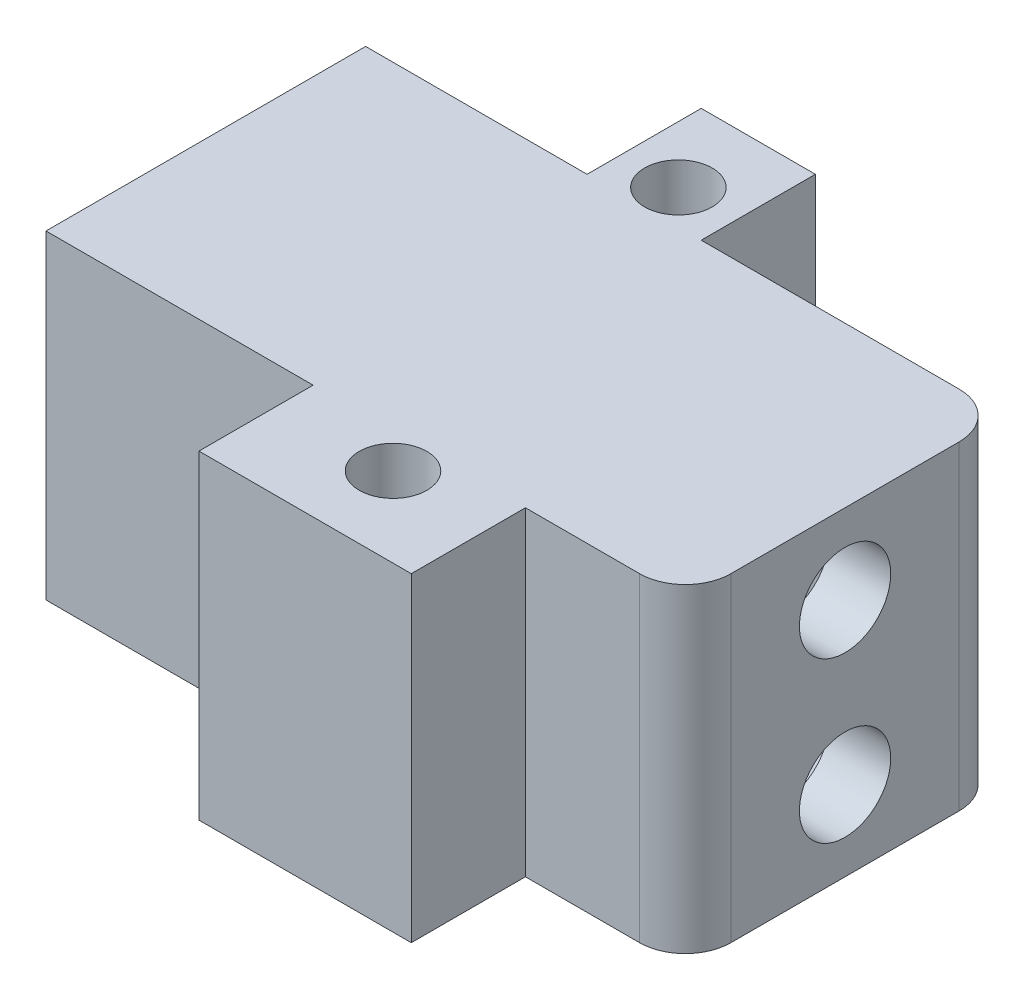
ISO-10303-21;
HEADER;
FILE_DESCRIPTION(('STEP AP214'),'2;1');
FILE_NAME('part.step','',(''),(''),'','','');
FILE_SCHEMA(('AUTOMOTIVE_DESIGN { 1 0 10303 214 1 1 1 1 }'));
ENDSEC;
DATA;
#1=APPLICATION_CONTEXT('core data for automotive mechanical design processes');
#2=APPLICATION_PROTOCOL_DEFINITION('international standard','automotive_design',2000,#1);
#3=PRODUCT_CONTEXT('',#1,'mechanical');
#4=PRODUCT('Part','Part','',(#3));
#5=PRODUCT_RELATED_PRODUCT_CATEGORY('part','',(#4));
#6=PRODUCT_DEFINITION_FORMATION('','',#4);
#7=PRODUCT_DEFINITION_CONTEXT('part definition',#1,'design');
#8=PRODUCT_DEFINITION('design','',#6,#7);
#9=PRODUCT_DEFINITION_SHAPE('','',#8);
#10=(LENGTH_UNIT() NAMED_UNIT(*) SI_UNIT(.MILLI.,.METRE.));
#11=(NAMED_UNIT(*) PLANE_ANGLE_UNIT() SI_UNIT($,.RADIAN.));
#12=(NAMED_UNIT(*) SI_UNIT($,.STERADIAN.) SOLID_ANGLE_UNIT());
#13=UNCERTAINTY_MEASURE_WITH_UNIT(LENGTH_MEASURE(1.E-05),#10,'distance_accuracy_value','');
#14=(GEOMETRIC_REPRESENTATION_CONTEXT(3) GLOBAL_UNCERTAINTY_ASSIGNED_CONTEXT((#13)) GLOBAL_UNIT_ASSIGNED_CONTEXT((#10,
#11,#12)) REPRESENTATION_CONTEXT('',''));
#15=CARTESIAN_POINT('',(0.,0.,0.));
#16=DIRECTION('',(0.,0.,1.));
#17=DIRECTION('',(1.,0.,0.));
#18=AXIS2_PLACEMENT_3D('',#15,#16,#17);
#19=CARTESIAN_POINT('',(-14.,14.,-7.));
#20=DIRECTION('',(0.,0.,1.));
#21=DIRECTION('',(1.,0.,0.));
#22=AXIS2_PLACEMENT_3D('',#19,#20,#21);
#23=PLANE('',#22);
#24=DIRECTION('',(0.,-1.,0.));
#25=VECTOR('',#24,1.);
#26=CARTESIAN_POINT('',(0.700000000000311,0.,-7.));
#27=LINE('',#26,#25);
#28=CARTESIAN_POINT('',(0.700000000000311,14.,-7.));
#29=VERTEX_POINT('',#28);
#30=CARTESIAN_POINT('',(0.700000000000311,0.,-7.));
#31=VERTEX_POINT('',#30);
#32=EDGE_CURVE('E70',#29,#31,#27,.T.);
#33=ORIENTED_EDGE('',*,*,#32,.F.);
#34=DIRECTION('',(-1.,0.,0.));
#35=VECTOR('',#34,1.);
#36=CARTESIAN_POINT('',(-14.,14.,-7.));
#37=LINE('',#36,#35);
#38=CARTESIAN_POINT('',(12.,14.,-7.));
#39=VERTEX_POINT('',#38);
#40=EDGE_CURVE('E281',#39,#29,#37,.T.);
#41=ORIENTED_EDGE('',*,*,#40,.F.);
#42=DIRECTION('',(0.,-1.,0.));
#43=VECTOR('',#42,1.);
#44=CARTESIAN_POINT('',(12.,14.,-7.));
#45=LINE('',#44,#43);
#46=CARTESIAN_POINT('',(12.,0.,-7.));
#47=VERTEX_POINT('',#46);
#48=EDGE_CURVE('E304',#39,#47,#45,.T.);
#49=ORIENTED_EDGE('',*,*,#48,.T.);
#50=DIRECTION('',(-1.,0.,0.));
#51=VECTOR('',#50,1.);
#52=CARTESIAN_POINT('',(-14.,0.,-7.));
#53=LINE('',#52,#51);
#54=EDGE_CURVE('E293',#47,#31,#53,.T.);
#55=ORIENTED_EDGE('',*,*,#54,.T.);
#56=EDGE_LOOP('',(#33,#41,#49,#55));
#57=FACE_BOUND('',#56,.T.);
#58=ADVANCED_FACE('F45',(#57),#23,.F.);
#59=CARTESIAN_POINT('',(-14.,14.,7.));
#60=DIRECTION('',(0.,0.,-1.));
#61=DIRECTION('',(-1.,0.,0.));
#62=AXIS2_PLACEMENT_3D('',#59,#60,#61);
#63=PLANE('',#62);
#64=DIRECTION('',(0.,-1.,0.));
#65=VECTOR('',#64,1.);
#66=CARTESIAN_POINT('',(-2.3,0.,7.));
#67=LINE('',#66,#65);
#68=CARTESIAN_POINT('',(-2.3,14.,7.));
#69=VERTEX_POINT('',#68);
#70=CARTESIAN_POINT('',(-2.3,0.,7.));
#71=VERTEX_POINT('',#70);
#72=EDGE_CURVE('E182',#69,#71,#67,.T.);
#73=ORIENTED_EDGE('',*,*,#72,.F.);
#74=DIRECTION('',(1.,0.,0.));
#75=VECTOR('',#74,1.);
#76=CARTESIAN_POINT('',(-14.,14.,7.));
#77=LINE('',#76,#75);
#78=CARTESIAN_POINT('',(-14.,14.,7.));
#79=VERTEX_POINT('',#78);
#80=EDGE_CURVE('E286',#79,#69,#77,.T.);
#81=ORIENTED_EDGE('',*,*,#80,.F.);
#82=DIRECTION('',(0.,-1.,0.));
#83=VECTOR('',#82,1.);
#84=CARTESIAN_POINT('',(-14.,14.,7.));
#85=LINE('',#84,#83);
#86=CARTESIAN_POINT('',(-14.,0.,7.));
#87=VERTEX_POINT('',#86);
#88=EDGE_CURVE('E289',#79,#87,#85,.T.);
#89=ORIENTED_EDGE('',*,*,#88,.T.);
#90=DIRECTION('',(1.,0.,0.));
#91=VECTOR('',#90,1.);
#92=CARTESIAN_POINT('',(-14.,0.,7.));
#93=LINE('',#92,#91);
#94=EDGE_CURVE('E280',#87,#71,#93,.T.);
#95=ORIENTED_EDGE('',*,*,#94,.T.);
#96=EDGE_LOOP('',(#73,#81,#89,#95));
#97=FACE_BOUND('',#96,.T.);
#98=ADVANCED_FACE('F356',(#97),#63,.F.);
#99=DIRECTION('',(0.,1.,0.));
#100=VECTOR('',#99,1.);
#101=CARTESIAN_POINT('',(7.,0.,7.));
#102=LINE('',#101,#100);
#103=CARTESIAN_POINT('',(7.,0.,7.));
#104=VERTEX_POINT('',#103);
#105=CARTESIAN_POINT('',(7.,14.,7.));
#106=VERTEX_POINT('',#105);
#107=EDGE_CURVE('E217',#104,#106,#102,.T.);
#108=ORIENTED_EDGE('',*,*,#107,.F.);
#109=CARTESIAN_POINT('',(12.,0.,7.));
#110=VERTEX_POINT('',#109);
#111=EDGE_CURVE('E297',#104,#110,#93,.T.);
#112=ORIENTED_EDGE('',*,*,#111,.T.);
#113=DIRECTION('',(0.,-1.,0.));
#114=VECTOR('',#113,1.);
#115=CARTESIAN_POINT('',(12.,14.,7.));
#116=LINE('',#115,#114);
#117=CARTESIAN_POINT('',(12.,14.,7.));
#118=VERTEX_POINT('',#117);
#119=EDGE_CURVE('E11',#110,#118,#116,.F.);
#120=ORIENTED_EDGE('',*,*,#119,.T.);
#121=EDGE_CURVE('E285',#106,#118,#77,.T.);
#122=ORIENTED_EDGE('',*,*,#121,.F.);
#123=EDGE_LOOP('',(#108,#112,#120,#122));
#124=FACE_BOUND('',#123,.T.);
#125=ADVANCED_FACE('F363',(#124),#63,.F.);
#126=CARTESIAN_POINT('',(14.,14.,-7.));
#127=DIRECTION('',(-1.,0.,0.));
#128=DIRECTION('',(0.,0.,1.));
#129=AXIS2_PLACEMENT_3D('',#126,#127,#128);
#130=PLANE('',#129);
#131=CARTESIAN_POINT('',(14.,10.5,0.));
#132=DIRECTION('',(1.,0.,0.));
#133=DIRECTION('',(0.,0.,-1.));
#134=AXIS2_PLACEMENT_3D('',#131,#132,#133);
#135=CIRCLE('',#134,2.);
#136=CARTESIAN_POINT('',(14.,10.5,-2.));
#137=VERTEX_POINT('',#136);
#138=EDGE_CURVE('E240',#137,#137,#135,.T.);
#139=ORIENTED_EDGE('',*,*,#138,.F.);
#140=EDGE_LOOP('',(#139));
#141=FACE_BOUND('',#140,.T.);
#142=CARTESIAN_POINT('',(14.,3.5,0.));
#143=DIRECTION('',(1.,0.,0.));
#144=DIRECTION('',(0.,0.,-1.));
#145=AXIS2_PLACEMENT_3D('',#142,#143,#144);
#146=CIRCLE('',#145,2.);
#147=CARTESIAN_POINT('',(14.,3.5,-2.));
#148=VERTEX_POINT('',#147);
#149=EDGE_CURVE('E239',#148,#148,#146,.T.);
#150=ORIENTED_EDGE('',*,*,#149,.F.);
#151=EDGE_LOOP('',(#150));
#152=FACE_BOUND('',#151,.T.);
#153=DIRECTION('',(0.,0.,-1.));
#154=VECTOR('',#153,1.);
#155=CARTESIAN_POINT('',(14.,0.,-7.));
#156=LINE('',#155,#154);
#157=CARTESIAN_POINT('',(14.,0.,5.));
#158=VERTEX_POINT('',#157);
#159=CARTESIAN_POINT('',(14.,0.,-5.));
#160=VERTEX_POINT('',#159);
#161=EDGE_CURVE('E271',#158,#160,#156,.T.);
#162=ORIENTED_EDGE('',*,*,#161,.T.);
#163=DIRECTION('',(0.,-1.,0.));
#164=VECTOR('',#163,1.);
#165=CARTESIAN_POINT('',(14.,14.,-5.));
#166=LINE('',#165,#164);
#167=CARTESIAN_POINT('',(14.,14.,-5.));
#168=VERTEX_POINT('',#167);
#169=EDGE_CURVE('E319',#160,#168,#166,.F.);
#170=ORIENTED_EDGE('',*,*,#169,.T.);
#171=DIRECTION('',(0.,0.,-1.));
#172=VECTOR('',#171,1.);
#173=CARTESIAN_POINT('',(14.,14.,-7.));
#174=LINE('',#173,#172);
#175=CARTESIAN_POINT('',(14.,14.,5.));
#176=VERTEX_POINT('',#175);
#177=EDGE_CURVE('E278',#176,#168,#174,.T.);
#178=ORIENTED_EDGE('',*,*,#177,.F.);
#179=DIRECTION('',(0.,-1.,0.));
#180=VECTOR('',#179,1.);
#181=CARTESIAN_POINT('',(14.,14.,5.));
#182=LINE('',#181,#180);
#183=EDGE_CURVE('E316',#176,#158,#182,.T.);
#184=ORIENTED_EDGE('',*,*,#183,.T.);
#185=EDGE_LOOP('',(#162,#170,#178,#184));
#186=FACE_BOUND('',#185,.T.);
#187=ADVANCED_FACE('F367',(#141,#152,#186),#130,.F.);
#188=CARTESIAN_POINT('',(-4.29999999999969,14.,-7.));
#189=VERTEX_POINT('',#188);
#190=CARTESIAN_POINT('',(-14.,14.,-7.));
#191=VERTEX_POINT('',#190);
#192=EDGE_CURVE('E62',#189,#191,#37,.T.);
#193=ORIENTED_EDGE('',*,*,#192,.F.);
#194=DIRECTION('',(0.,-1.,0.));
#195=VECTOR('',#194,1.);
#196=CARTESIAN_POINT('',(-4.29999999999969,0.,-7.));
#197=LINE('',#196,#195);
#198=CARTESIAN_POINT('',(-4.29999999999969,0.,-7.));
#199=VERTEX_POINT('',#198);
#200=EDGE_CURVE('E180',#189,#199,#197,.T.);
#201=ORIENTED_EDGE('',*,*,#200,.T.);
#202=CARTESIAN_POINT('',(-14.,0.,-7.));
#203=VERTEX_POINT('',#202);
#204=EDGE_CURVE('E292',#199,#203,#53,.T.);
#205=ORIENTED_EDGE('',*,*,#204,.T.);
#206=DIRECTION('',(0.,-1.,0.));
#207=VECTOR('',#206,1.);
#208=CARTESIAN_POINT('',(-14.,14.,-7.));
#209=LINE('',#208,#207);
#210=EDGE_CURVE('E301',#191,#203,#209,.T.);
#211=ORIENTED_EDGE('',*,*,#210,.F.);
#212=EDGE_LOOP('',(#193,#201,#205,#211));
#213=FACE_BOUND('',#212,.T.);
#214=ADVANCED_FACE('F351',(#213),#23,.F.);
#215=CARTESIAN_POINT('',(-14.,14.,-7.));
#216=DIRECTION('',(1.,0.,0.));
#217=DIRECTION('',(0.,0.,-1.));
#218=AXIS2_PLACEMENT_3D('',#215,#216,#217);
#219=PLANE('',#218);
#220=DIRECTION('',(0.,-1.,0.));
#221=VECTOR('',#220,1.);
#222=CARTESIAN_POINT('',(-14.,13.,5.));
#223=LINE('',#222,#221);
#224=CARTESIAN_POINT('',(-14.,13.,5.));
#225=VERTEX_POINT('',#224);
#226=CARTESIAN_POINT('',(-14.,0.999999999999999,5.));
#227=VERTEX_POINT('',#226);
#228=EDGE_CURVE('E260',#225,#227,#223,.T.);
#229=ORIENTED_EDGE('',*,*,#228,.T.);
#230=DIRECTION('',(0.,0.,1.));
#231=VECTOR('',#230,1.);
#232=CARTESIAN_POINT('',(-14.,1.,-5.));
#233=LINE('',#232,#231);
#234=CARTESIAN_POINT('',(-14.,1.,-5.));
#235=VERTEX_POINT('',#234);
#236=EDGE_CURVE('E258',#235,#227,#233,.T.);
#237=ORIENTED_EDGE('',*,*,#236,.F.);
#238=DIRECTION('',(0.,-1.,0.));
#239=VECTOR('',#238,1.);
#240=CARTESIAN_POINT('',(-14.,13.,-5.));
#241=LINE('',#240,#239);
#242=CARTESIAN_POINT('',(-14.,13.,-5.));
#243=VERTEX_POINT('',#242);
#244=EDGE_CURVE('E250',#243,#235,#241,.T.);
#245=ORIENTED_EDGE('',*,*,#244,.F.);
#246=DIRECTION('',(0.,0.,1.));
#247=VECTOR('',#246,1.);
#248=CARTESIAN_POINT('',(-14.,13.,-5.));
#249=LINE('',#248,#247);
#250=EDGE_CURVE('E264',#243,#225,#249,.T.);
#251=ORIENTED_EDGE('',*,*,#250,.T.);
#252=EDGE_LOOP('',(#229,#237,#245,#251));
#253=FACE_BOUND('',#252,.T.);
#254=DIRECTION('',(0.,0.,1.));
#255=VECTOR('',#254,1.);
#256=CARTESIAN_POINT('',(-14.,0.,-7.));
#257=LINE('',#256,#255);
#258=EDGE_CURVE('E295',#203,#87,#257,.T.);
#259=ORIENTED_EDGE('',*,*,#258,.T.);
#260=ORIENTED_EDGE('',*,*,#88,.F.);
#261=DIRECTION('',(0.,0.,1.));
#262=VECTOR('',#261,1.);
#263=CARTESIAN_POINT('',(-14.,14.,-7.));
#264=LINE('',#263,#262);
#265=EDGE_CURVE('E283',#191,#79,#264,.T.);
#266=ORIENTED_EDGE('',*,*,#265,.F.);
#267=ORIENTED_EDGE('',*,*,#210,.T.);
#268=EDGE_LOOP('',(#259,#260,#266,#267));
#269=FACE_BOUND('',#268,.T.);
#270=ADVANCED_FACE('F340',(#253,#269),#219,.F.);
#271=CARTESIAN_POINT('',(0.,14.,0.));
#272=DIRECTION('',(0.,1.,0.));
#273=DIRECTION('',(0.,0.,1.));
#274=AXIS2_PLACEMENT_3D('',#271,#272,#273);
#275=PLANE('',#274);
#276=CARTESIAN_POINT('',(2.69999999999893,14.,8.49999999999966));
#277=DIRECTION('',(0.,1.,0.));
#278=DIRECTION('',(0.,0.,1.));
#279=AXIS2_PLACEMENT_3D('',#276,#277,#278);
#280=CIRCLE('',#279,1.47999999999999);
#281=CARTESIAN_POINT('',(2.69999999999893,14.,9.97999999999965));
#282=VERTEX_POINT('',#281);
#283=EDGE_CURVE('E325',#282,#282,#280,.T.);
#284=ORIENTED_EDGE('',*,*,#283,.F.);
#285=EDGE_LOOP('',(#284));
#286=FACE_BOUND('',#285,.T.);
#287=CARTESIAN_POINT('',(-1.80000000000077,14.,-8.50000000000041));
#288=DIRECTION('',(0.,1.,0.));
#289=DIRECTION('',(0.,0.,1.));
#290=AXIS2_PLACEMENT_3D('',#287,#288,#289);
#291=CIRCLE('',#290,1.47999999999999);
#292=CARTESIAN_POINT('',(-1.80000000000077,14.,-7.02000000000042));
#293=VERTEX_POINT('',#292);
#294=EDGE_CURVE('E201',#293,#293,#291,.T.);
#295=ORIENTED_EDGE('',*,*,#294,.F.);
#296=EDGE_LOOP('',(#295));
#297=FACE_BOUND('',#296,.T.);
#298=ORIENTED_EDGE('',*,*,#177,.T.);
#299=CARTESIAN_POINT('',(12.,14.,-5.));
#300=DIRECTION('',(0.,1.,0.));
#301=DIRECTION('',(0.,0.,1.));
#302=AXIS2_PLACEMENT_3D('',#299,#300,#301);
#303=CIRCLE('',#302,2.);
#304=EDGE_CURVE('E54',#168,#39,#303,.T.);
#305=ORIENTED_EDGE('',*,*,#304,.T.);
#306=ORIENTED_EDGE('',*,*,#40,.T.);
#307=DIRECTION('',(0.,0.,1.));
#308=VECTOR('',#307,1.);
#309=CARTESIAN_POINT('',(0.700000000000311,14.,-12.));
#310=LINE('',#309,#308);
#311=CARTESIAN_POINT('',(0.700000000000311,14.,-12.));
#312=VERTEX_POINT('',#311);
#313=EDGE_CURVE('E183',#312,#29,#310,.T.);
#314=ORIENTED_EDGE('',*,*,#313,.F.);
#315=DIRECTION('',(1.,0.,0.));
#316=VECTOR('',#315,1.);
#317=CARTESIAN_POINT('',(0.,14.,-12.));
#318=LINE('',#317,#316);
#319=CARTESIAN_POINT('',(-4.29999999999969,14.,-12.));
#320=VERTEX_POINT('',#319);
#321=EDGE_CURVE('E186',#320,#312,#318,.T.);
#322=ORIENTED_EDGE('',*,*,#321,.F.);
#323=DIRECTION('',(0.,0.,1.));
#324=VECTOR('',#323,1.);
#325=CARTESIAN_POINT('',(-4.29999999999969,14.,-12.));
#326=LINE('',#325,#324);
#327=EDGE_CURVE('E174',#320,#189,#326,.T.);
#328=ORIENTED_EDGE('',*,*,#327,.T.);
#329=ORIENTED_EDGE('',*,*,#192,.T.);
#330=ORIENTED_EDGE('',*,*,#265,.T.);
#331=ORIENTED_EDGE('',*,*,#80,.T.);
#332=DIRECTION('',(0.,0.,-1.));
#333=VECTOR('',#332,1.);
#334=CARTESIAN_POINT('',(-2.3,14.,12.));
#335=LINE('',#334,#333);
#336=CARTESIAN_POINT('',(-2.3,14.,12.));
#337=VERTEX_POINT('',#336);
#338=EDGE_CURVE('E223',#337,#69,#335,.T.);
#339=ORIENTED_EDGE('',*,*,#338,.F.);
#340=DIRECTION('',(-1.,0.,0.));
#341=VECTOR('',#340,1.);
#342=CARTESIAN_POINT('',(-2.3,14.,12.));
#343=LINE('',#342,#341);
#344=CARTESIAN_POINT('',(7.,14.,12.));
#345=VERTEX_POINT('',#344);
#346=EDGE_CURVE('E221',#345,#337,#343,.T.);
#347=ORIENTED_EDGE('',*,*,#346,.F.);
#348=DIRECTION('',(0.,0.,-1.));
#349=VECTOR('',#348,1.);
#350=CARTESIAN_POINT('',(7.,14.,12.));
#351=LINE('',#350,#349);
#352=EDGE_CURVE('E230',#345,#106,#351,.T.);
#353=ORIENTED_EDGE('',*,*,#352,.T.);
#354=ORIENTED_EDGE('',*,*,#121,.T.);
#355=CARTESIAN_POINT('',(12.,14.,5.));
#356=DIRECTION('',(0.,1.,0.));
#357=DIRECTION('',(0.,0.,1.));
#358=AXIS2_PLACEMENT_3D('',#355,#356,#357);
#359=CIRCLE('',#358,2.);
#360=EDGE_CURVE('E321',#118,#176,#359,.T.);
#361=ORIENTED_EDGE('',*,*,#360,.T.);
#362=EDGE_LOOP('',(#298,#305,#306,#314,#322,#328,#329,#330,#331,#339,#347,#353,#354,#361));
#363=FACE_BOUND('',#362,.T.);
#364=ADVANCED_FACE('F188',(#286,#297,#363),#275,.T.);
#365=CARTESIAN_POINT('',(0.,0.,0.));
#366=DIRECTION('',(0.,1.,0.));
#367=DIRECTION('',(0.,0.,1.));
#368=AXIS2_PLACEMENT_3D('',#365,#366,#367);
#369=PLANE('',#368);
#370=CARTESIAN_POINT('',(2.69999999999893,0.,8.49999999999966));
#371=DIRECTION('',(0.,1.,0.));
#372=DIRECTION('',(0.,0.,1.));
#373=AXIS2_PLACEMENT_3D('',#370,#371,#372);
#374=CIRCLE('',#373,1.47999999999999);
#375=CARTESIAN_POINT('',(2.69999999999893,0.,9.97999999999965));
#376=VERTEX_POINT('',#375);
#377=EDGE_CURVE('E49',#376,#376,#374,.T.);
#378=ORIENTED_EDGE('',*,*,#377,.T.);
#379=EDGE_LOOP('',(#378));
#380=FACE_BOUND('',#379,.T.);
#381=CARTESIAN_POINT('',(-1.80000000000077,0.,-8.50000000000041));
#382=DIRECTION('',(0.,1.,0.));
#383=DIRECTION('',(0.,0.,1.));
#384=AXIS2_PLACEMENT_3D('',#381,#382,#383);
#385=CIRCLE('',#384,1.47999999999999);
#386=CARTESIAN_POINT('',(-1.80000000000077,0.,-7.02000000000042));
#387=VERTEX_POINT('',#386);
#388=EDGE_CURVE('E323',#387,#387,#385,.T.);
#389=ORIENTED_EDGE('',*,*,#388,.T.);
#390=EDGE_LOOP('',(#389));
#391=FACE_BOUND('',#390,.T.);
#392=ORIENTED_EDGE('',*,*,#54,.F.);
#393=CARTESIAN_POINT('',(12.,0.,-5.));
#394=DIRECTION('',(0.,1.,0.));
#395=DIRECTION('',(0.,0.,1.));
#396=AXIS2_PLACEMENT_3D('',#393,#394,#395);
#397=CIRCLE('',#396,2.);
#398=EDGE_CURVE('E314',#47,#160,#397,.F.);
#399=ORIENTED_EDGE('',*,*,#398,.T.);
#400=ORIENTED_EDGE('',*,*,#161,.F.);
#401=CARTESIAN_POINT('',(12.,0.,5.));
#402=DIRECTION('',(0.,1.,0.));
#403=DIRECTION('',(0.,0.,1.));
#404=AXIS2_PLACEMENT_3D('',#401,#402,#403);
#405=CIRCLE('',#404,2.);
#406=EDGE_CURVE('E311',#158,#110,#405,.F.);
#407=ORIENTED_EDGE('',*,*,#406,.T.);
#408=ORIENTED_EDGE('',*,*,#111,.F.);
#409=DIRECTION('',(0.,0.,-1.));
#410=VECTOR('',#409,1.);
#411=CARTESIAN_POINT('',(7.,0.,12.));
#412=LINE('',#411,#410);
#413=CARTESIAN_POINT('',(7.,0.,12.));
#414=VERTEX_POINT('',#413);
#415=EDGE_CURVE('E233',#414,#104,#412,.T.);
#416=ORIENTED_EDGE('',*,*,#415,.F.);
#417=DIRECTION('',(1.,0.,0.));
#418=VECTOR('',#417,1.);
#419=CARTESIAN_POINT('',(-2.3,0.,12.));
#420=LINE('',#419,#418);
#421=CARTESIAN_POINT('',(-2.3,0.,12.));
#422=VERTEX_POINT('',#421);
#423=EDGE_CURVE('E216',#422,#414,#420,.T.);
#424=ORIENTED_EDGE('',*,*,#423,.F.);
#425=DIRECTION('',(0.,0.,-1.));
#426=VECTOR('',#425,1.);
#427=CARTESIAN_POINT('',(-2.3,0.,12.));
#428=LINE('',#427,#426);
#429=EDGE_CURVE('E236',#422,#71,#428,.T.);
#430=ORIENTED_EDGE('',*,*,#429,.T.);
#431=ORIENTED_EDGE('',*,*,#94,.F.);
#432=ORIENTED_EDGE('',*,*,#258,.F.);
#433=ORIENTED_EDGE('',*,*,#204,.F.);
#434=DIRECTION('',(0.,0.,1.));
#435=VECTOR('',#434,1.);
#436=CARTESIAN_POINT('',(-4.29999999999969,0.,-12.));
#437=LINE('',#436,#435);
#438=CARTESIAN_POINT('',(-4.29999999999969,0.,-12.));
#439=VERTEX_POINT('',#438);
#440=EDGE_CURVE('E206',#439,#199,#437,.T.);
#441=ORIENTED_EDGE('',*,*,#440,.F.);
#442=DIRECTION('',(-1.,0.,0.));
#443=VECTOR('',#442,1.);
#444=CARTESIAN_POINT('',(0.,0.,-12.));
#445=LINE('',#444,#443);
#446=CARTESIAN_POINT('',(0.700000000000311,0.,-12.));
#447=VERTEX_POINT('',#446);
#448=EDGE_CURVE('E196',#447,#439,#445,.T.);
#449=ORIENTED_EDGE('',*,*,#448,.F.);
#450=DIRECTION('',(0.,0.,1.));
#451=VECTOR('',#450,1.);
#452=CARTESIAN_POINT('',(0.700000000000311,0.,-12.));
#453=LINE('',#452,#451);
#454=EDGE_CURVE('E209',#447,#31,#453,.T.);
#455=ORIENTED_EDGE('',*,*,#454,.T.);
#456=EDGE_LOOP('',(#392,#399,#400,#407,#408,#416,#424,#430,#431,#432,#433,#441,#449,#455));
#457=FACE_BOUND('',#456,.T.);
#458=ADVANCED_FACE('F339',(#380,#391,#457),#369,.F.);
#459=CARTESIAN_POINT('',(11.3,1.,-5.));
#460=DIRECTION('',(0.,-1.,0.));
#461=DIRECTION('',(0.,0.,-1.));
#462=AXIS2_PLACEMENT_3D('',#459,#460,#461);
#463=PLANE('',#462);
#464=ORIENTED_EDGE('',*,*,#236,.T.);
#465=DIRECTION('',(-1.,0.,0.));
#466=VECTOR('',#465,1.);
#467=CARTESIAN_POINT('',(11.3,1.,4.99999999999999));
#468=LINE('',#467,#466);
#469=CARTESIAN_POINT('',(11.3,1.,4.99999999999999));
#470=VERTEX_POINT('',#469);
#471=EDGE_CURVE('E257',#470,#227,#468,.T.);
#472=ORIENTED_EDGE('',*,*,#471,.F.);
#473=DIRECTION('',(0.,0.,1.));
#474=VECTOR('',#473,1.);
#475=CARTESIAN_POINT('',(11.3,1.,-5.));
#476=LINE('',#475,#474);
#477=CARTESIAN_POINT('',(11.3,1.,-5.));
#478=VERTEX_POINT('',#477);
#479=EDGE_CURVE('E246',#478,#470,#476,.T.);
#480=ORIENTED_EDGE('',*,*,#479,.F.);
#481=DIRECTION('',(-1.,0.,0.));
#482=VECTOR('',#481,1.);
#483=CARTESIAN_POINT('',(11.3,1.,-5.));
#484=LINE('',#483,#482);
#485=EDGE_CURVE('E269',#478,#235,#484,.T.);
#486=ORIENTED_EDGE('',*,*,#485,.T.);
#487=EDGE_LOOP('',(#464,#472,#480,#486));
#488=FACE_BOUND('',#487,.T.);
#489=ADVANCED_FACE('F347',(#488),#463,.F.);
#490=CARTESIAN_POINT('',(11.3,13.,-5.00000000000001));
#491=DIRECTION('',(0.,0.,-1.));
#492=DIRECTION('',(0.,1.,0.));
#493=AXIS2_PLACEMENT_3D('',#490,#491,#492);
#494=PLANE('',#493);
#495=ORIENTED_EDGE('',*,*,#244,.T.);
#496=ORIENTED_EDGE('',*,*,#485,.F.);
#497=DIRECTION('',(0.,-1.,0.));
#498=VECTOR('',#497,1.);
#499=CARTESIAN_POINT('',(11.3,13.,-5.00000000000001));
#500=LINE('',#499,#498);
#501=CARTESIAN_POINT('',(11.3,13.,-5.00000000000001));
#502=VERTEX_POINT('',#501);
#503=EDGE_CURVE('E254',#502,#478,#500,.T.);
#504=ORIENTED_EDGE('',*,*,#503,.F.);
#505=DIRECTION('',(-1.,0.,0.));
#506=VECTOR('',#505,1.);
#507=CARTESIAN_POINT('',(11.3,13.,-5.00000000000001));
#508=LINE('',#507,#506);
#509=EDGE_CURVE('E272',#502,#243,#508,.T.);
#510=ORIENTED_EDGE('',*,*,#509,.T.);
#511=EDGE_LOOP('',(#495,#496,#504,#510));
#512=FACE_BOUND('',#511,.T.);
#513=ADVANCED_FACE('F428',(#512),#494,.F.);
#514=CARTESIAN_POINT('',(11.3,13.,-5.00000000000001));
#515=DIRECTION('',(0.,-1.,0.));
#516=DIRECTION('',(0.,0.,-1.));
#517=AXIS2_PLACEMENT_3D('',#514,#515,#516);
#518=PLANE('',#517);
#519=ORIENTED_EDGE('',*,*,#250,.F.);
#520=ORIENTED_EDGE('',*,*,#509,.F.);
#521=DIRECTION('',(0.,0.,1.));
#522=VECTOR('',#521,1.);
#523=CARTESIAN_POINT('',(11.3,13.,-5.00000000000001));
#524=LINE('',#523,#522);
#525=CARTESIAN_POINT('',(11.3,13.,4.99999999999999));
#526=VERTEX_POINT('',#525);
#527=EDGE_CURVE('E252',#502,#526,#524,.T.);
#528=ORIENTED_EDGE('',*,*,#527,.T.);
#529=DIRECTION('',(-1.,0.,0.));
#530=VECTOR('',#529,1.);
#531=CARTESIAN_POINT('',(11.3,13.,4.99999999999999));
#532=LINE('',#531,#530);
#533=EDGE_CURVE('E274',#526,#225,#532,.T.);
#534=ORIENTED_EDGE('',*,*,#533,.T.);
#535=EDGE_LOOP('',(#519,#520,#528,#534));
#536=FACE_BOUND('',#535,.T.);
#537=ADVANCED_FACE('F431',(#536),#518,.T.);
#538=CARTESIAN_POINT('',(11.3,13.,4.99999999999999));
#539=DIRECTION('',(0.,0.,-1.));
#540=DIRECTION('',(-1.,0.,0.));
#541=AXIS2_PLACEMENT_3D('',#538,#539,#540);
#542=PLANE('',#541);
#543=ORIENTED_EDGE('',*,*,#228,.F.);
#544=ORIENTED_EDGE('',*,*,#533,.F.);
#545=DIRECTION('',(0.,-1.,0.));
#546=VECTOR('',#545,1.);
#547=CARTESIAN_POINT('',(11.3,13.,4.99999999999999));
#548=LINE('',#547,#546);
#549=EDGE_CURVE('E249',#526,#470,#548,.T.);
#550=ORIENTED_EDGE('',*,*,#549,.T.);
#551=ORIENTED_EDGE('',*,*,#471,.T.);
#552=EDGE_LOOP('',(#543,#544,#550,#551));
#553=FACE_BOUND('',#552,.T.);
#554=ADVANCED_FACE('F426',(#553),#542,.T.);
#555=CARTESIAN_POINT('',(11.3,0.,0.));
#556=DIRECTION('',(1.,0.,0.));
#557=DIRECTION('',(0.,0.,-1.));
#558=AXIS2_PLACEMENT_3D('',#555,#556,#557);
#559=PLANE('',#558);
#560=CARTESIAN_POINT('',(11.3,10.5,0.));
#561=DIRECTION('',(1.,0.,0.));
#562=DIRECTION('',(0.,0.,-1.));
#563=AXIS2_PLACEMENT_3D('',#560,#561,#562);
#564=CIRCLE('',#563,2.);
#565=CARTESIAN_POINT('',(11.3,10.5,-2.));
#566=VERTEX_POINT('',#565);
#567=EDGE_CURVE('E261',#566,#566,#564,.T.);
#568=ORIENTED_EDGE('',*,*,#567,.T.);
#569=EDGE_LOOP('',(#568));
#570=FACE_BOUND('',#569,.T.);
#571=CARTESIAN_POINT('',(11.3,3.5,0.));
#572=DIRECTION('',(1.,0.,0.));
#573=DIRECTION('',(0.,0.,-1.));
#574=AXIS2_PLACEMENT_3D('',#571,#572,#573);
#575=CIRCLE('',#574,2.);
#576=CARTESIAN_POINT('',(11.3,3.5,-2.));
#577=VERTEX_POINT('',#576);
#578=EDGE_CURVE('E243',#577,#577,#575,.T.);
#579=ORIENTED_EDGE('',*,*,#578,.T.);
#580=EDGE_LOOP('',(#579));
#581=FACE_BOUND('',#580,.T.);
#582=ORIENTED_EDGE('',*,*,#479,.T.);
#583=ORIENTED_EDGE('',*,*,#549,.F.);
#584=ORIENTED_EDGE('',*,*,#527,.F.);
#585=ORIENTED_EDGE('',*,*,#503,.T.);
#586=EDGE_LOOP('',(#582,#583,#584,#585));
#587=FACE_BOUND('',#586,.T.);
#588=ADVANCED_FACE('F422',(#570,#581,#587),#559,.F.);
#589=CARTESIAN_POINT('',(-11.5,3.5,0.));
#590=DIRECTION('',(1.,0.,0.));
#591=DIRECTION('',(0.,0.,-1.));
#592=AXIS2_PLACEMENT_3D('',#589,#590,#591);
#593=CYLINDRICAL_SURFACE('',#592,2.);
#594=ORIENTED_EDGE('',*,*,#149,.T.);
#595=EDGE_LOOP('',(#594));
#596=FACE_BOUND('',#595,.T.);
#597=ORIENTED_EDGE('',*,*,#578,.F.);
#598=EDGE_LOOP('',(#597));
#599=FACE_BOUND('',#598,.T.);
#600=ADVANCED_FACE('F389',(#596,#599),#593,.F.);
#601=CARTESIAN_POINT('',(-11.5,10.5,0.));
#602=DIRECTION('',(1.,0.,0.));
#603=DIRECTION('',(0.,0.,-1.));
#604=AXIS2_PLACEMENT_3D('',#601,#602,#603);
#605=CYLINDRICAL_SURFACE('',#604,2.);
#606=ORIENTED_EDGE('',*,*,#138,.T.);
#607=EDGE_LOOP('',(#606));
#608=FACE_BOUND('',#607,.T.);
#609=ORIENTED_EDGE('',*,*,#567,.F.);
#610=EDGE_LOOP('',(#609));
#611=FACE_BOUND('',#610,.T.);
#612=ADVANCED_FACE('F382',(#608,#611),#605,.F.);
#613=CARTESIAN_POINT('',(12.,14.,-5.));
#614=DIRECTION('',(0.,-1.,0.));
#615=DIRECTION('',(0.,0.,-1.));
#616=AXIS2_PLACEMENT_3D('',#613,#614,#615);
#617=CYLINDRICAL_SURFACE('',#616,2.);
#618=ORIENTED_EDGE('',*,*,#304,.F.);
#619=ORIENTED_EDGE('',*,*,#169,.F.);
#620=ORIENTED_EDGE('',*,*,#398,.F.);
#621=ORIENTED_EDGE('',*,*,#48,.F.);
#622=EDGE_LOOP('',(#618,#619,#620,#621));
#623=FACE_BOUND('',#622,.T.);
#624=ADVANCED_FACE('F381',(#623),#617,.T.);
#625=CARTESIAN_POINT('',(12.,14.,5.));
#626=DIRECTION('',(0.,-1.,0.));
#627=DIRECTION('',(0.,0.,-1.));
#628=AXIS2_PLACEMENT_3D('',#625,#626,#627);
#629=CYLINDRICAL_SURFACE('',#628,2.);
#630=ORIENTED_EDGE('',*,*,#360,.F.);
#631=ORIENTED_EDGE('',*,*,#119,.F.);
#632=ORIENTED_EDGE('',*,*,#406,.F.);
#633=ORIENTED_EDGE('',*,*,#183,.F.);
#634=EDGE_LOOP('',(#630,#631,#632,#633));
#635=FACE_BOUND('',#634,.T.);
#636=ADVANCED_FACE('F47',(#635),#629,.T.);
#637=CARTESIAN_POINT('',(-2.3,0.,12.));
#638=DIRECTION('',(1.,0.,0.));
#639=DIRECTION('',(0.,1.,0.));
#640=AXIS2_PLACEMENT_3D('',#637,#638,#639);
#641=PLANE('',#640);
#642=ORIENTED_EDGE('',*,*,#72,.T.);
#643=ORIENTED_EDGE('',*,*,#429,.F.);
#644=DIRECTION('',(0.,-1.,0.));
#645=VECTOR('',#644,1.);
#646=CARTESIAN_POINT('',(-2.3,0.,12.));
#647=LINE('',#646,#645);
#648=EDGE_CURVE('E213',#337,#422,#647,.T.);
#649=ORIENTED_EDGE('',*,*,#648,.F.);
#650=ORIENTED_EDGE('',*,*,#338,.T.);
#651=EDGE_LOOP('',(#642,#643,#649,#650));
#652=FACE_BOUND('',#651,.T.);
#653=ADVANCED_FACE('F387',(#652),#641,.F.);
#654=CARTESIAN_POINT('',(7.,0.,12.));
#655=DIRECTION('',(-1.,0.,0.));
#656=DIRECTION('',(0.,0.,1.));
#657=AXIS2_PLACEMENT_3D('',#654,#655,#656);
#658=PLANE('',#657);
#659=ORIENTED_EDGE('',*,*,#107,.T.);
#660=ORIENTED_EDGE('',*,*,#352,.F.);
#661=DIRECTION('',(0.,1.,0.));
#662=VECTOR('',#661,1.);
#663=CARTESIAN_POINT('',(7.,0.,12.));
#664=LINE('',#663,#662);
#665=EDGE_CURVE('E219',#414,#345,#664,.T.);
#666=ORIENTED_EDGE('',*,*,#665,.F.);
#667=ORIENTED_EDGE('',*,*,#415,.T.);
#668=EDGE_LOOP('',(#659,#660,#666,#667));
#669=FACE_BOUND('',#668,.T.);
#670=ADVANCED_FACE('F412',(#669),#658,.F.);
#671=CARTESIAN_POINT('',(0.,0.,12.));
#672=DIRECTION('',(0.,0.,-1.));
#673=DIRECTION('',(-1.,0.,0.));
#674=AXIS2_PLACEMENT_3D('',#671,#672,#673);
#675=PLANE('',#674);
#676=ORIENTED_EDGE('',*,*,#648,.T.);
#677=ORIENTED_EDGE('',*,*,#423,.T.);
#678=ORIENTED_EDGE('',*,*,#665,.T.);
#679=ORIENTED_EDGE('',*,*,#346,.T.);
#680=EDGE_LOOP('',(#676,#677,#678,#679));
#681=FACE_BOUND('',#680,.T.);
#682=ADVANCED_FACE('F407',(#681),#675,.F.);
#683=CARTESIAN_POINT('',(-4.29999999999969,0.,-12.));
#684=DIRECTION('',(-1.,0.,0.));
#685=DIRECTION('',(0.,-1.,0.));
#686=AXIS2_PLACEMENT_3D('',#683,#684,#685);
#687=PLANE('',#686);
#688=ORIENTED_EDGE('',*,*,#200,.F.);
#689=ORIENTED_EDGE('',*,*,#327,.F.);
#690=DIRECTION('',(0.,-1.,0.));
#691=VECTOR('',#690,1.);
#692=CARTESIAN_POINT('',(-4.29999999999969,0.,-12.));
#693=LINE('',#692,#691);
#694=EDGE_CURVE('E179',#320,#439,#693,.T.);
#695=ORIENTED_EDGE('',*,*,#694,.T.);
#696=ORIENTED_EDGE('',*,*,#440,.T.);
#697=EDGE_LOOP('',(#688,#689,#695,#696));
#698=FACE_BOUND('',#697,.T.);
#699=ADVANCED_FACE('F176',(#698),#687,.T.);
#700=CARTESIAN_POINT('',(0.700000000000311,0.,-12.));
#701=DIRECTION('',(-1.,0.,0.));
#702=DIRECTION('',(0.,0.,1.));
#703=AXIS2_PLACEMENT_3D('',#700,#701,#702);
#704=PLANE('',#703);
#705=ORIENTED_EDGE('',*,*,#32,.T.);
#706=ORIENTED_EDGE('',*,*,#454,.F.);
#707=DIRECTION('',(0.,-1.,0.));
#708=VECTOR('',#707,1.);
#709=CARTESIAN_POINT('',(0.700000000000311,0.,-12.));
#710=LINE('',#709,#708);
#711=EDGE_CURVE('E192',#312,#447,#710,.T.);
#712=ORIENTED_EDGE('',*,*,#711,.F.);
#713=ORIENTED_EDGE('',*,*,#313,.T.);
#714=EDGE_LOOP('',(#705,#706,#712,#713));
#715=FACE_BOUND('',#714,.T.);
#716=ADVANCED_FACE('F401',(#715),#704,.F.);
#717=CARTESIAN_POINT('',(0.,0.,-12.));
#718=DIRECTION('',(0.,0.,-1.));
#719=DIRECTION('',(-1.,0.,0.));
#720=AXIS2_PLACEMENT_3D('',#717,#718,#719);
#721=PLANE('',#720);
#722=ORIENTED_EDGE('',*,*,#694,.F.);
#723=ORIENTED_EDGE('',*,*,#321,.T.);
#724=ORIENTED_EDGE('',*,*,#711,.T.);
#725=ORIENTED_EDGE('',*,*,#448,.T.);
#726=EDGE_LOOP('',(#722,#723,#724,#725));
#727=FACE_BOUND('',#726,.T.);
#728=ADVANCED_FACE('F194',(#727),#721,.T.);
#729=CARTESIAN_POINT('',(-1.80000000000077,-6.,-8.50000000000041));
#730=DIRECTION('',(0.,1.,0.));
#731=DIRECTION('',(0.,0.,1.));
#732=AXIS2_PLACEMENT_3D('',#729,#730,#731);
#733=CYLINDRICAL_SURFACE('',#732,1.47999999999999);
#734=ORIENTED_EDGE('',*,*,#294,.T.);
#735=EDGE_LOOP('',(#734));
#736=FACE_BOUND('',#735,.T.);
#737=ORIENTED_EDGE('',*,*,#388,.F.);
#738=EDGE_LOOP('',(#737));
#739=FACE_BOUND('',#738,.T.);
#740=ADVANCED_FACE('F335',(#736,#739),#733,.F.);
#741=CARTESIAN_POINT('',(2.69999999999893,-6.,8.49999999999966));
#742=DIRECTION('',(0.,1.,0.));
#743=DIRECTION('',(0.,0.,1.));
#744=AXIS2_PLACEMENT_3D('',#741,#742,#743);
#745=CYLINDRICAL_SURFACE('',#744,1.47999999999999);
#746=ORIENTED_EDGE('',*,*,#283,.T.);
#747=EDGE_LOOP('',(#746));
#748=FACE_BOUND('',#747,.T.);
#749=ORIENTED_EDGE('',*,*,#377,.F.);
#750=EDGE_LOOP('',(#749));
#751=FACE_BOUND('',#750,.T.);
#752=ADVANCED_FACE('F591',(#748,#751),#745,.F.);
#753=CLOSED_SHELL('',(#58,#98,#125,#187,#214,#270,#364,#458,#489,#513,#537,#554,#588,#600,#612,
#624,#636,#653,#670,#682,#699,#716,#728,#740,#752));
#754=MANIFOLD_SOLID_BREP('B2',#753);
#755=ADVANCED_BREP_SHAPE_REPRESENTATION('',(#18,#754),#14);
#756=SHAPE_DEFINITION_REPRESENTATION(#9,#755);
ENDSEC;
END-ISO-10303-21;
